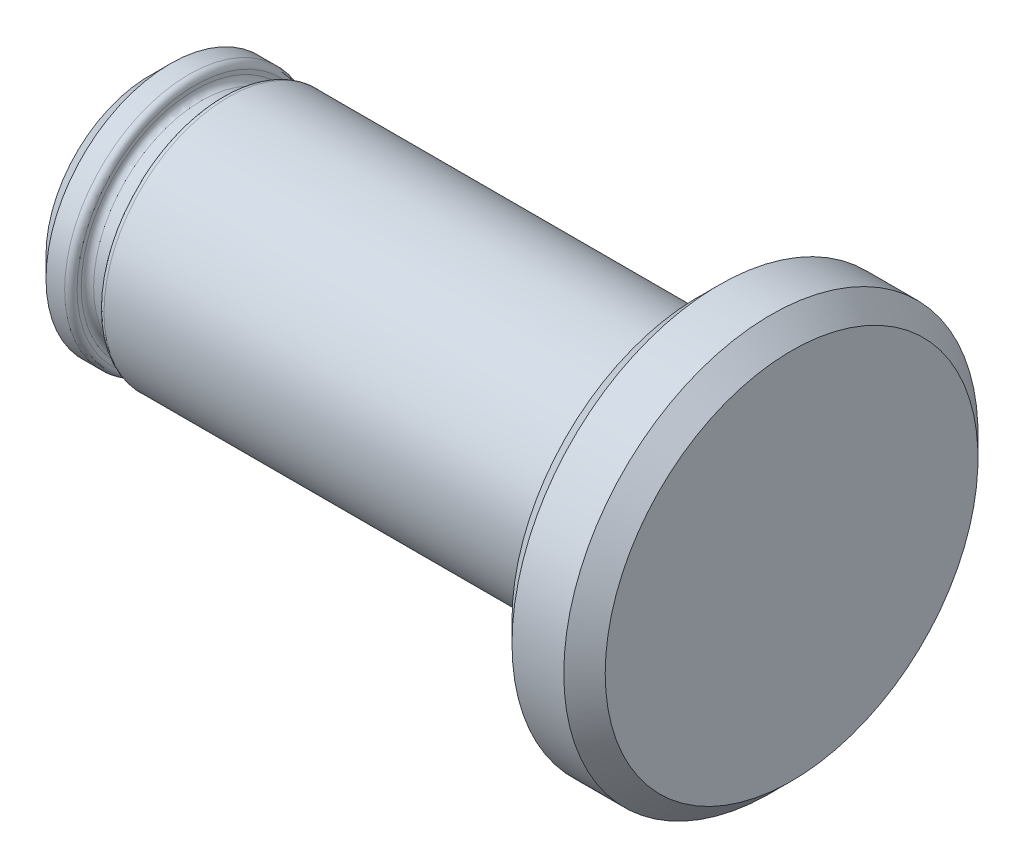
ISO-10303-21;
HEADER;
FILE_DESCRIPTION(('STEP AP214'),'2;1');
FILE_NAME('part.step','',(''),(''),'','','');
FILE_SCHEMA(('AUTOMOTIVE_DESIGN { 1 0 10303 214 1 1 1 1 }'));
ENDSEC;
DATA;
#1=APPLICATION_CONTEXT('core data for automotive mechanical design processes');
#2=APPLICATION_PROTOCOL_DEFINITION('international standard','automotive_design',2000,#1);
#3=PRODUCT_CONTEXT('',#1,'mechanical');
#4=PRODUCT('Part','Part','',(#3));
#5=PRODUCT_RELATED_PRODUCT_CATEGORY('part','',(#4));
#6=PRODUCT_DEFINITION_FORMATION('','',#4);
#7=PRODUCT_DEFINITION_CONTEXT('part definition',#1,'design');
#8=PRODUCT_DEFINITION('design','',#6,#7);
#9=PRODUCT_DEFINITION_SHAPE('','',#8);
#10=(LENGTH_UNIT() NAMED_UNIT(*) SI_UNIT(.MILLI.,.METRE.));
#11=(NAMED_UNIT(*) PLANE_ANGLE_UNIT() SI_UNIT($,.RADIAN.));
#12=(NAMED_UNIT(*) SI_UNIT($,.STERADIAN.) SOLID_ANGLE_UNIT());
#13=UNCERTAINTY_MEASURE_WITH_UNIT(LENGTH_MEASURE(1.E-05),#10,'distance_accuracy_value','');
#14=(GEOMETRIC_REPRESENTATION_CONTEXT(3) GLOBAL_UNCERTAINTY_ASSIGNED_CONTEXT((#13)) GLOBAL_UNIT_ASSIGNED_CONTEXT((#10,
#11,#12)) REPRESENTATION_CONTEXT('',''));
#15=CARTESIAN_POINT('',(0.,0.,0.));
#16=DIRECTION('',(0.,0.,1.));
#17=DIRECTION('',(1.,0.,0.));
#18=AXIS2_PLACEMENT_3D('',#15,#16,#17);
#19=CARTESIAN_POINT('',(4.5,0.,9.));
#20=DIRECTION('',(1.,0.,0.));
#21=DIRECTION('',(0.,0.,-1.));
#22=AXIS2_PLACEMENT_3D('',#19,#20,#21);
#23=PLANE('',#22);
#24=CARTESIAN_POINT('',(4.5,0.,0.));
#25=DIRECTION('',(-1.,0.,0.));
#26=DIRECTION('',(0.,0.,1.));
#27=AXIS2_PLACEMENT_3D('',#24,#25,#26);
#28=CIRCLE('',#27,9.00000000000001);
#29=CARTESIAN_POINT('',(4.5,0.,9.));
#30=VERTEX_POINT('',#29);
#31=EDGE_CURVE('E10',#30,#30,#28,.T.);
#32=ORIENTED_EDGE('',*,*,#31,.F.);
#33=EDGE_LOOP('',(#32));
#34=FACE_BOUND('',#33,.T.);
#35=ADVANCED_FACE('F43',(#34),#23,.T.);
#36=CARTESIAN_POINT('',(3.5,0.,0.));
#37=DIRECTION('',(-1.,0.,0.));
#38=DIRECTION('',(0.,0.,1.));
#39=AXIS2_PLACEMENT_3D('',#36,#37,#38);
#40=CONICAL_SURFACE('',#39,10.,0.785398163397447);
#41=ORIENTED_EDGE('',*,*,#31,.T.);
#42=EDGE_LOOP('',(#41));
#43=FACE_BOUND('',#42,.T.);
#44=CARTESIAN_POINT('',(3.5,0.,0.));
#45=DIRECTION('',(-1.,0.,0.));
#46=DIRECTION('',(0.,0.,1.));
#47=AXIS2_PLACEMENT_3D('',#44,#45,#46);
#48=CIRCLE('',#47,10.);
#49=CARTESIAN_POINT('',(3.5,0.,10.));
#50=VERTEX_POINT('',#49);
#51=EDGE_CURVE('E50',#50,#50,#48,.T.);
#52=ORIENTED_EDGE('',*,*,#51,.F.);
#53=EDGE_LOOP('',(#52));
#54=FACE_BOUND('',#53,.T.);
#55=ADVANCED_FACE('F131',(#43,#54),#40,.T.);
#56=CARTESIAN_POINT('',(-26.5,0.,0.));
#57=DIRECTION('',(-1.,0.,0.));
#58=DIRECTION('',(0.,0.,1.));
#59=AXIS2_PLACEMENT_3D('',#56,#57,#58);
#60=CYLINDRICAL_SURFACE('',#59,10.);
#61=ORIENTED_EDGE('',*,*,#51,.T.);
#62=EDGE_LOOP('',(#61));
#63=FACE_BOUND('',#62,.T.);
#64=CARTESIAN_POINT('',(1.,0.,0.));
#65=DIRECTION('',(-1.,0.,0.));
#66=DIRECTION('',(0.,0.,1.));
#67=AXIS2_PLACEMENT_3D('',#64,#65,#66);
#68=CIRCLE('',#67,10.);
#69=CARTESIAN_POINT('',(1.,0.,10.));
#70=VERTEX_POINT('',#69);
#71=EDGE_CURVE('E55',#70,#70,#68,.T.);
#72=ORIENTED_EDGE('',*,*,#71,.F.);
#73=EDGE_LOOP('',(#72));
#74=FACE_BOUND('',#73,.T.);
#75=ADVANCED_FACE('F136',(#63,#74),#60,.T.);
#76=CARTESIAN_POINT('',(0.,0.,0.));
#77=DIRECTION('',(1.,0.,0.));
#78=DIRECTION('',(0.,0.,-1.));
#79=AXIS2_PLACEMENT_3D('',#76,#77,#78);
#80=CONICAL_SURFACE('',#79,9.00000000000001,0.785398163397447);
#81=ORIENTED_EDGE('',*,*,#71,.T.);
#82=EDGE_LOOP('',(#81));
#83=FACE_BOUND('',#82,.T.);
#84=CARTESIAN_POINT('',(0.,0.,0.));
#85=DIRECTION('',(-1.,0.,0.));
#86=DIRECTION('',(0.,0.,1.));
#87=AXIS2_PLACEMENT_3D('',#84,#85,#86);
#88=CIRCLE('',#87,9.00000000000001);
#89=CARTESIAN_POINT('',(0.,0.,9.));
#90=VERTEX_POINT('',#89);
#91=EDGE_CURVE('E60',#90,#90,#88,.T.);
#92=ORIENTED_EDGE('',*,*,#91,.F.);
#93=EDGE_LOOP('',(#92));
#94=FACE_BOUND('',#93,.T.);
#95=ADVANCED_FACE('F140',(#83,#94),#80,.T.);
#96=CARTESIAN_POINT('',(0.,0.,9.));
#97=DIRECTION('',(-1.,0.,0.));
#98=DIRECTION('',(0.,0.,1.));
#99=AXIS2_PLACEMENT_3D('',#96,#97,#98);
#100=PLANE('',#99);
#101=ORIENTED_EDGE('',*,*,#91,.T.);
#102=EDGE_LOOP('',(#101));
#103=FACE_BOUND('',#102,.T.);
#104=CARTESIAN_POINT('',(0.,0.,0.));
#105=DIRECTION('',(-1.,0.,0.));
#106=DIRECTION('',(0.,0.,1.));
#107=AXIS2_PLACEMENT_3D('',#104,#105,#106);
#108=CIRCLE('',#107,8.);
#109=CARTESIAN_POINT('',(0.,0.,8.));
#110=VERTEX_POINT('',#109);
#111=EDGE_CURVE('E66',#110,#110,#108,.T.);
#112=ORIENTED_EDGE('',*,*,#111,.F.);
#113=EDGE_LOOP('',(#112));
#114=FACE_BOUND('',#113,.T.);
#115=ADVANCED_FACE('F146',(#103,#114),#100,.T.);
#116=CARTESIAN_POINT('',(-2.,0.,0.));
#117=DIRECTION('',(-1.,0.,0.));
#118=DIRECTION('',(0.,0.,1.));
#119=AXIS2_PLACEMENT_3D('',#116,#117,#118);
#120=TOROIDAL_SURFACE('',#119,8.,2.);
#121=ORIENTED_EDGE('',*,*,#111,.T.);
#122=EDGE_LOOP('',(#121));
#123=FACE_BOUND('',#122,.T.);
#124=CARTESIAN_POINT('',(-2.,0.,0.));
#125=DIRECTION('',(-1.,0.,0.));
#126=DIRECTION('',(0.,0.,1.));
#127=AXIS2_PLACEMENT_3D('',#124,#125,#126);
#128=CIRCLE('',#127,6.);
#129=CARTESIAN_POINT('',(-2.,0.,6.));
#130=VERTEX_POINT('',#129);
#131=EDGE_CURVE('E70',#130,#130,#128,.T.);
#132=ORIENTED_EDGE('',*,*,#131,.F.);
#133=EDGE_LOOP('',(#132));
#134=FACE_BOUND('',#133,.T.);
#135=ADVANCED_FACE('F150',(#123,#134),#120,.F.);
#136=CARTESIAN_POINT('',(-26.5,0.,0.));
#137=DIRECTION('',(-1.,0.,0.));
#138=DIRECTION('',(0.,0.,1.));
#139=AXIS2_PLACEMENT_3D('',#136,#137,#138);
#140=CYLINDRICAL_SURFACE('',#139,6.);
#141=ORIENTED_EDGE('',*,*,#131,.T.);
#142=EDGE_LOOP('',(#141));
#143=FACE_BOUND('',#142,.T.);
#144=CARTESIAN_POINT('',(-22.7,0.,0.));
#145=DIRECTION('',(-1.,0.,0.));
#146=DIRECTION('',(0.,0.,1.));
#147=AXIS2_PLACEMENT_3D('',#144,#145,#146);
#148=CIRCLE('',#147,6.);
#149=CARTESIAN_POINT('',(-22.7,0.,6.));
#150=VERTEX_POINT('',#149);
#151=EDGE_CURVE('E74',#150,#150,#148,.T.);
#152=ORIENTED_EDGE('',*,*,#151,.F.);
#153=EDGE_LOOP('',(#152));
#154=FACE_BOUND('',#153,.T.);
#155=ADVANCED_FACE('F154',(#143,#154),#140,.T.);
#156=CARTESIAN_POINT('',(-22.7,0.,0.));
#157=DIRECTION('',(-1.,0.,0.));
#158=DIRECTION('',(0.,0.,1.));
#159=AXIS2_PLACEMENT_3D('',#156,#157,#158);
#160=TOROIDAL_SURFACE('',#159,5.7,0.300000000000001);
#161=ORIENTED_EDGE('',*,*,#151,.T.);
#162=EDGE_LOOP('',(#161));
#163=FACE_BOUND('',#162,.T.);
#164=CARTESIAN_POINT('',(-23.,0.,0.));
#165=DIRECTION('',(-1.,0.,0.));
#166=DIRECTION('',(0.,0.,1.));
#167=AXIS2_PLACEMENT_3D('',#164,#165,#166);
#168=CIRCLE('',#167,5.7);
#169=CARTESIAN_POINT('',(-23.,0.,5.7));
#170=VERTEX_POINT('',#169);
#171=EDGE_CURVE('E78',#170,#170,#168,.T.);
#172=ORIENTED_EDGE('',*,*,#171,.F.);
#173=EDGE_LOOP('',(#172));
#174=FACE_BOUND('',#173,.T.);
#175=ADVANCED_FACE('F158',(#163,#174),#160,.T.);
#176=CARTESIAN_POINT('',(-23.,0.,5.5));
#177=DIRECTION('',(-1.,0.,0.));
#178=DIRECTION('',(0.,0.,1.));
#179=AXIS2_PLACEMENT_3D('',#176,#177,#178);
#180=PLANE('',#179);
#181=ORIENTED_EDGE('',*,*,#171,.T.);
#182=EDGE_LOOP('',(#181));
#183=FACE_BOUND('',#182,.T.);
#184=CARTESIAN_POINT('',(-23.,0.,0.));
#185=DIRECTION('',(-1.,0.,0.));
#186=DIRECTION('',(0.,0.,1.));
#187=AXIS2_PLACEMENT_3D('',#184,#185,#186);
#188=CIRCLE('',#187,5.5);
#189=CARTESIAN_POINT('',(-23.,0.,5.5));
#190=VERTEX_POINT('',#189);
#191=EDGE_CURVE('E82',#190,#190,#188,.T.);
#192=ORIENTED_EDGE('',*,*,#191,.F.);
#193=EDGE_LOOP('',(#192));
#194=FACE_BOUND('',#193,.T.);
#195=ADVANCED_FACE('F162',(#183,#194),#180,.T.);
#196=CARTESIAN_POINT('',(-23.3,0.,0.));
#197=DIRECTION('',(-1.,0.,0.));
#198=DIRECTION('',(0.,0.,1.));
#199=AXIS2_PLACEMENT_3D('',#196,#197,#198);
#200=TOROIDAL_SURFACE('',#199,5.5,0.3);
#201=ORIENTED_EDGE('',*,*,#191,.T.);
#202=EDGE_LOOP('',(#201));
#203=FACE_BOUND('',#202,.T.);
#204=CARTESIAN_POINT('',(-23.3,0.,0.));
#205=DIRECTION('',(-1.,0.,0.));
#206=DIRECTION('',(0.,0.,1.));
#207=AXIS2_PLACEMENT_3D('',#204,#205,#206);
#208=CIRCLE('',#207,5.2);
#209=CARTESIAN_POINT('',(-23.3,0.,5.2));
#210=VERTEX_POINT('',#209);
#211=EDGE_CURVE('E86',#210,#210,#208,.T.);
#212=ORIENTED_EDGE('',*,*,#211,.F.);
#213=EDGE_LOOP('',(#212));
#214=FACE_BOUND('',#213,.T.);
#215=ADVANCED_FACE('F166',(#203,#214),#200,.F.);
#216=CARTESIAN_POINT('',(-26.5,0.,0.));
#217=DIRECTION('',(-1.,0.,0.));
#218=DIRECTION('',(0.,0.,1.));
#219=AXIS2_PLACEMENT_3D('',#216,#217,#218);
#220=CYLINDRICAL_SURFACE('',#219,5.2);
#221=ORIENTED_EDGE('',*,*,#211,.T.);
#222=EDGE_LOOP('',(#221));
#223=FACE_BOUND('',#222,.T.);
#224=CARTESIAN_POINT('',(-24.,0.,0.));
#225=DIRECTION('',(-1.,0.,0.));
#226=DIRECTION('',(0.,0.,1.));
#227=AXIS2_PLACEMENT_3D('',#224,#225,#226);
#228=CIRCLE('',#227,5.2);
#229=CARTESIAN_POINT('',(-24.,0.,5.2));
#230=VERTEX_POINT('',#229);
#231=EDGE_CURVE('E90',#230,#230,#228,.T.);
#232=ORIENTED_EDGE('',*,*,#231,.F.);
#233=EDGE_LOOP('',(#232));
#234=FACE_BOUND('',#233,.T.);
#235=ADVANCED_FACE('F170',(#223,#234),#220,.T.);
#236=CARTESIAN_POINT('',(-24.,0.,0.));
#237=DIRECTION('',(-1.,0.,0.));
#238=DIRECTION('',(0.,0.,1.));
#239=AXIS2_PLACEMENT_3D('',#236,#237,#238);
#240=TOROIDAL_SURFACE('',#239,5.5,0.3);
#241=ORIENTED_EDGE('',*,*,#231,.T.);
#242=EDGE_LOOP('',(#241));
#243=FACE_BOUND('',#242,.T.);
#244=CARTESIAN_POINT('',(-24.3,0.,0.));
#245=DIRECTION('',(-1.,0.,0.));
#246=DIRECTION('',(0.,0.,1.));
#247=AXIS2_PLACEMENT_3D('',#244,#245,#246);
#248=CIRCLE('',#247,5.5);
#249=CARTESIAN_POINT('',(-24.3,0.,5.5));
#250=VERTEX_POINT('',#249);
#251=EDGE_CURVE('E94',#250,#250,#248,.T.);
#252=ORIENTED_EDGE('',*,*,#251,.F.);
#253=EDGE_LOOP('',(#252));
#254=FACE_BOUND('',#253,.T.);
#255=ADVANCED_FACE('F174',(#243,#254),#240,.F.);
#256=CARTESIAN_POINT('',(-24.3,0.,5.7));
#257=DIRECTION('',(1.,0.,0.));
#258=DIRECTION('',(0.,0.,-1.));
#259=AXIS2_PLACEMENT_3D('',#256,#257,#258);
#260=PLANE('',#259);
#261=ORIENTED_EDGE('',*,*,#251,.T.);
#262=EDGE_LOOP('',(#261));
#263=FACE_BOUND('',#262,.T.);
#264=CARTESIAN_POINT('',(-24.3,0.,0.));
#265=DIRECTION('',(-1.,0.,0.));
#266=DIRECTION('',(0.,0.,1.));
#267=AXIS2_PLACEMENT_3D('',#264,#265,#266);
#268=CIRCLE('',#267,5.7);
#269=CARTESIAN_POINT('',(-24.3,0.,5.7));
#270=VERTEX_POINT('',#269);
#271=EDGE_CURVE('E98',#270,#270,#268,.T.);
#272=ORIENTED_EDGE('',*,*,#271,.F.);
#273=EDGE_LOOP('',(#272));
#274=FACE_BOUND('',#273,.T.);
#275=ADVANCED_FACE('F178',(#263,#274),#260,.T.);
#276=CARTESIAN_POINT('',(-24.6,0.,0.));
#277=DIRECTION('',(-1.,0.,0.));
#278=DIRECTION('',(0.,0.,1.));
#279=AXIS2_PLACEMENT_3D('',#276,#277,#278);
#280=TOROIDAL_SURFACE('',#279,5.7,0.300000000000001);
#281=ORIENTED_EDGE('',*,*,#271,.T.);
#282=EDGE_LOOP('',(#281));
#283=FACE_BOUND('',#282,.T.);
#284=CARTESIAN_POINT('',(-24.6,0.,0.));
#285=DIRECTION('',(-1.,0.,0.));
#286=DIRECTION('',(0.,0.,1.));
#287=AXIS2_PLACEMENT_3D('',#284,#285,#286);
#288=CIRCLE('',#287,6.);
#289=CARTESIAN_POINT('',(-24.6,0.,6.));
#290=VERTEX_POINT('',#289);
#291=EDGE_CURVE('E102',#290,#290,#288,.T.);
#292=ORIENTED_EDGE('',*,*,#291,.F.);
#293=EDGE_LOOP('',(#292));
#294=FACE_BOUND('',#293,.T.);
#295=ADVANCED_FACE('F127',(#283,#294),#280,.T.);
#296=CARTESIAN_POINT('',(-26.5,0.,0.));
#297=DIRECTION('',(-1.,0.,0.));
#298=DIRECTION('',(0.,0.,1.));
#299=AXIS2_PLACEMENT_3D('',#296,#297,#298);
#300=CYLINDRICAL_SURFACE('',#299,6.);
#301=ORIENTED_EDGE('',*,*,#291,.T.);
#302=EDGE_LOOP('',(#301));
#303=FACE_BOUND('',#302,.T.);
#304=CARTESIAN_POINT('',(-25.5,0.,0.));
#305=DIRECTION('',(-1.,0.,0.));
#306=DIRECTION('',(0.,0.,1.));
#307=AXIS2_PLACEMENT_3D('',#304,#305,#306);
#308=CIRCLE('',#307,6.);
#309=CARTESIAN_POINT('',(-25.5,0.,6.));
#310=VERTEX_POINT('',#309);
#311=EDGE_CURVE('E106',#310,#310,#308,.T.);
#312=ORIENTED_EDGE('',*,*,#311,.F.);
#313=EDGE_LOOP('',(#312));
#314=FACE_BOUND('',#313,.T.);
#315=ADVANCED_FACE('F119',(#303,#314),#300,.T.);
#316=CARTESIAN_POINT('',(-26.5,0.,0.));
#317=DIRECTION('',(1.,0.,0.));
#318=DIRECTION('',(0.,0.,-1.));
#319=AXIS2_PLACEMENT_3D('',#316,#317,#318);
#320=CONICAL_SURFACE('',#319,5.,0.785398163397448);
#321=ORIENTED_EDGE('',*,*,#311,.T.);
#322=EDGE_LOOP('',(#321));
#323=FACE_BOUND('',#322,.T.);
#324=CARTESIAN_POINT('',(-26.5,0.,0.));
#325=DIRECTION('',(-1.,0.,0.));
#326=DIRECTION('',(0.,0.,1.));
#327=AXIS2_PLACEMENT_3D('',#324,#325,#326);
#328=CIRCLE('',#327,5.);
#329=CARTESIAN_POINT('',(-26.5,0.,5.));
#330=VERTEX_POINT('',#329);
#331=EDGE_CURVE('E110',#330,#330,#328,.T.);
#332=ORIENTED_EDGE('',*,*,#331,.F.);
#333=EDGE_LOOP('',(#332));
#334=FACE_BOUND('',#333,.T.);
#335=ADVANCED_FACE('F117',(#323,#334),#320,.T.);
#336=CARTESIAN_POINT('',(-26.5,0.,0.));
#337=DIRECTION('',(-1.,0.,0.));
#338=DIRECTION('',(0.,0.,1.));
#339=AXIS2_PLACEMENT_3D('',#336,#337,#338);
#340=PLANE('',#339);
#341=ORIENTED_EDGE('',*,*,#331,.T.);
#342=EDGE_LOOP('',(#341));
#343=FACE_BOUND('',#342,.T.);
#344=ADVANCED_FACE('F115',(#343),#340,.T.);
#345=CLOSED_SHELL('',(#35,#55,#75,#95,#115,#135,#155,#175,#195,#215,#235,#255,#275,#295,#315,
#335,#344));
#346=MANIFOLD_SOLID_BREP('B2',#345);
#347=ADVANCED_BREP_SHAPE_REPRESENTATION('',(#18,#346),#14);
#348=SHAPE_DEFINITION_REPRESENTATION(#9,#347);
ENDSEC;
END-ISO-10303-21;
